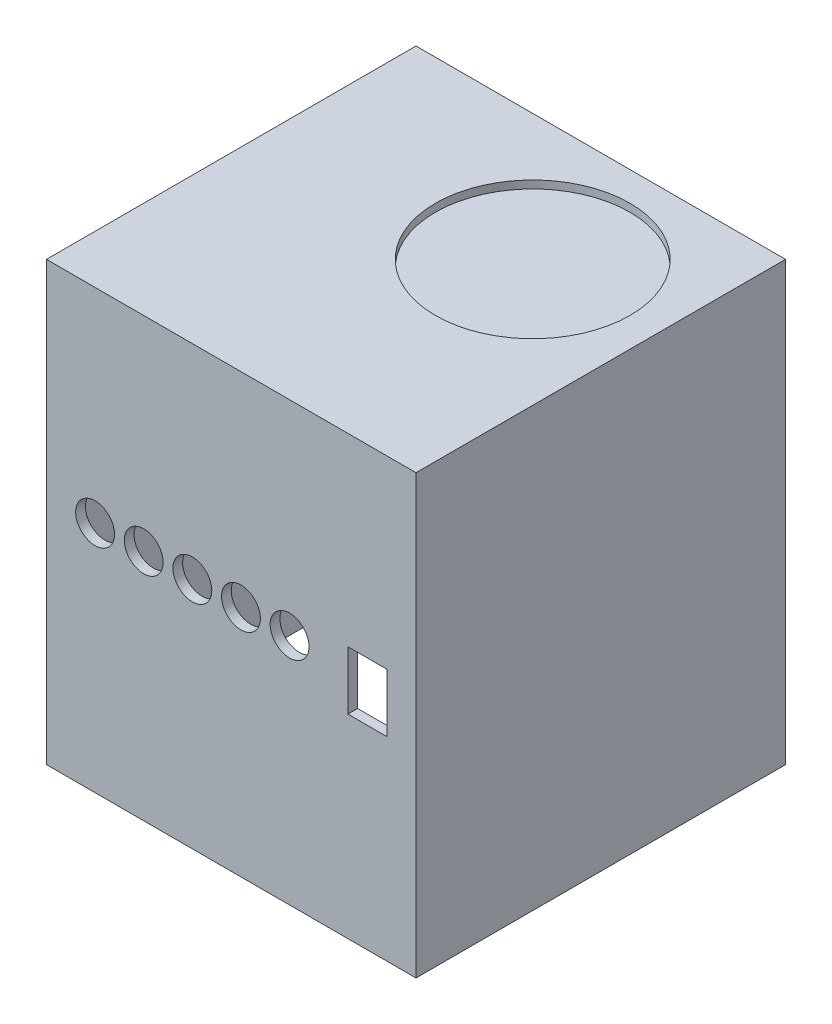
ISO-10303-21;
HEADER;
FILE_DESCRIPTION(('STEP AP214'),'2;1');
FILE_NAME('part.step','',(''),(''),'','','');
FILE_SCHEMA(('AUTOMOTIVE_DESIGN { 1 0 10303 214 1 1 1 1 }'));
ENDSEC;
DATA;
#1=APPLICATION_CONTEXT('core data for automotive mechanical design processes');
#2=APPLICATION_PROTOCOL_DEFINITION('international standard','automotive_design',2000,#1);
#3=PRODUCT_CONTEXT('',#1,'mechanical');
#4=PRODUCT('Part','Part','',(#3));
#5=PRODUCT_RELATED_PRODUCT_CATEGORY('part','',(#4));
#6=PRODUCT_DEFINITION_FORMATION('','',#4);
#7=PRODUCT_DEFINITION_CONTEXT('part definition',#1,'design');
#8=PRODUCT_DEFINITION('design','',#6,#7);
#9=PRODUCT_DEFINITION_SHAPE('','',#8);
#10=(LENGTH_UNIT() NAMED_UNIT(*) SI_UNIT(.MILLI.,.METRE.));
#11=(NAMED_UNIT(*) PLANE_ANGLE_UNIT() SI_UNIT($,.RADIAN.));
#12=(NAMED_UNIT(*) SI_UNIT($,.STERADIAN.) SOLID_ANGLE_UNIT());
#13=UNCERTAINTY_MEASURE_WITH_UNIT(LENGTH_MEASURE(1.E-05),#10,'distance_accuracy_value','');
#14=(GEOMETRIC_REPRESENTATION_CONTEXT(3) GLOBAL_UNCERTAINTY_ASSIGNED_CONTEXT((#13)) GLOBAL_UNIT_ASSIGNED_CONTEXT((#10,
#11,#12)) REPRESENTATION_CONTEXT('',''));
#15=CARTESIAN_POINT('',(0.,0.,0.));
#16=DIRECTION('',(0.,0.,1.));
#17=DIRECTION('',(1.,0.,0.));
#18=AXIS2_PLACEMENT_3D('',#15,#16,#17);
#19=CARTESIAN_POINT('',(0.,0.,0.));
#20=DIRECTION('',(0.,-1.,0.));
#21=DIRECTION('',(0.,0.,-1.));
#22=AXIS2_PLACEMENT_3D('',#19,#20,#21);
#23=PLANE('',#22);
#24=DIRECTION('',(0.,0.,1.));
#25=VECTOR('',#24,1.);
#26=CARTESIAN_POINT('',(-47.5,0.,0.));
#27=LINE('',#26,#25);
#28=CARTESIAN_POINT('',(-47.5,0.,-47.5));
#29=VERTEX_POINT('',#28);
#30=CARTESIAN_POINT('',(-47.5,0.,47.5));
#31=VERTEX_POINT('',#30);
#32=EDGE_CURVE('E187',#29,#31,#27,.T.);
#33=ORIENTED_EDGE('',*,*,#32,.F.);
#34=DIRECTION('',(-1.,0.,0.));
#35=VECTOR('',#34,1.);
#36=CARTESIAN_POINT('',(0.,0.,-47.5));
#37=LINE('',#36,#35);
#38=CARTESIAN_POINT('',(47.5,0.,-47.5));
#39=VERTEX_POINT('',#38);
#40=EDGE_CURVE('E199',#39,#29,#37,.T.);
#41=ORIENTED_EDGE('',*,*,#40,.F.);
#42=DIRECTION('',(0.,0.,-1.));
#43=VECTOR('',#42,1.);
#44=CARTESIAN_POINT('',(47.5,0.,0.));
#45=LINE('',#44,#43);
#46=CARTESIAN_POINT('',(47.5,0.,47.5));
#47=VERTEX_POINT('',#46);
#48=EDGE_CURVE('E217',#47,#39,#45,.T.);
#49=ORIENTED_EDGE('',*,*,#48,.F.);
#50=DIRECTION('',(1.,0.,0.));
#51=VECTOR('',#50,1.);
#52=CARTESIAN_POINT('',(0.,0.,47.5));
#53=LINE('',#52,#51);
#54=EDGE_CURVE('E216',#31,#47,#53,.T.);
#55=ORIENTED_EDGE('',*,*,#54,.F.);
#56=EDGE_LOOP('',(#33,#41,#49,#55));
#57=FACE_BOUND('',#56,.T.);
#58=DIRECTION('',(-1.,0.,0.));
#59=VECTOR('',#58,1.);
#60=CARTESIAN_POINT('',(-45.,0.,-45.));
#61=LINE('',#60,#59);
#62=CARTESIAN_POINT('',(45.,0.,-45.));
#63=VERTEX_POINT('',#62);
#64=CARTESIAN_POINT('',(-45.,0.,-45.));
#65=VERTEX_POINT('',#64);
#66=EDGE_CURVE('E162',#63,#65,#61,.T.);
#67=ORIENTED_EDGE('',*,*,#66,.T.);
#68=DIRECTION('',(0.,0.,1.));
#69=VECTOR('',#68,1.);
#70=CARTESIAN_POINT('',(-45.,0.,45.));
#71=LINE('',#70,#69);
#72=CARTESIAN_POINT('',(-45.,0.,45.));
#73=VERTEX_POINT('',#72);
#74=EDGE_CURVE('E168',#65,#73,#71,.T.);
#75=ORIENTED_EDGE('',*,*,#74,.T.);
#76=DIRECTION('',(1.,0.,0.));
#77=VECTOR('',#76,1.);
#78=CARTESIAN_POINT('',(-45.,0.,45.));
#79=LINE('',#78,#77);
#80=CARTESIAN_POINT('',(45.,0.,45.));
#81=VERTEX_POINT('',#80);
#82=EDGE_CURVE('E175',#73,#81,#79,.T.);
#83=ORIENTED_EDGE('',*,*,#82,.T.);
#84=DIRECTION('',(0.,0.,-1.));
#85=VECTOR('',#84,1.);
#86=CARTESIAN_POINT('',(45.,0.,45.));
#87=LINE('',#86,#85);
#88=EDGE_CURVE('E178',#81,#63,#87,.T.);
#89=ORIENTED_EDGE('',*,*,#88,.T.);
#90=EDGE_LOOP('',(#67,#75,#83,#89));
#91=FACE_BOUND('',#90,.T.);
#92=ADVANCED_FACE('F39',(#57,#91),#23,.T.);
#93=CARTESIAN_POINT('',(-47.5,110.,45.));
#94=DIRECTION('',(1.,0.,0.));
#95=DIRECTION('',(0.,0.,-1.));
#96=AXIS2_PLACEMENT_3D('',#93,#94,#95);
#97=PLANE('',#96);
#98=ORIENTED_EDGE('',*,*,#32,.T.);
#99=DIRECTION('',(0.,-1.,0.));
#100=VECTOR('',#99,1.);
#101=CARTESIAN_POINT('',(-47.5,110.,47.5));
#102=LINE('',#101,#100);
#103=CARTESIAN_POINT('',(-47.5,112.5,47.5));
#104=VERTEX_POINT('',#103);
#105=EDGE_CURVE('E193',#104,#31,#102,.T.);
#106=ORIENTED_EDGE('',*,*,#105,.F.);
#107=DIRECTION('',(0.,0.,1.));
#108=VECTOR('',#107,1.);
#109=CARTESIAN_POINT('',(-47.5,112.5,0.));
#110=LINE('',#109,#108);
#111=CARTESIAN_POINT('',(-47.5,112.5,-47.5));
#112=VERTEX_POINT('',#111);
#113=EDGE_CURVE('E198',#112,#104,#110,.T.);
#114=ORIENTED_EDGE('',*,*,#113,.F.);
#115=DIRECTION('',(0.,-1.,0.));
#116=VECTOR('',#115,1.);
#117=CARTESIAN_POINT('',(-47.5,110.,-47.5));
#118=LINE('',#117,#116);
#119=EDGE_CURVE('E203',#112,#29,#118,.T.);
#120=ORIENTED_EDGE('',*,*,#119,.T.);
#121=EDGE_LOOP('',(#98,#106,#114,#120));
#122=FACE_BOUND('',#121,.T.);
#123=ADVANCED_FACE('F285',(#122),#97,.F.);
#124=CARTESIAN_POINT('',(-45.,110.,47.5));
#125=DIRECTION('',(0.,0.,-1.));
#126=DIRECTION('',(-1.,0.,0.));
#127=AXIS2_PLACEMENT_3D('',#124,#125,#126);
#128=PLANE('',#127);
#129=CARTESIAN_POINT('',(-35.,60.,47.5));
#130=DIRECTION('',(0.,0.,1.));
#131=DIRECTION('',(1.,0.,0.));
#132=AXIS2_PLACEMENT_3D('',#129,#130,#131);
#133=CIRCLE('',#132,5.);
#134=CARTESIAN_POINT('',(-30.,60.,47.5));
#135=VERTEX_POINT('',#134);
#136=EDGE_CURVE('E228',#135,#135,#133,.T.);
#137=ORIENTED_EDGE('',*,*,#136,.F.);
#138=EDGE_LOOP('',(#137));
#139=FACE_BOUND('',#138,.T.);
#140=CARTESIAN_POINT('',(-22.5,60.,47.5));
#141=DIRECTION('',(0.,0.,1.));
#142=DIRECTION('',(1.,0.,0.));
#143=AXIS2_PLACEMENT_3D('',#140,#141,#142);
#144=CIRCLE('',#143,5.);
#145=CARTESIAN_POINT('',(-17.5,60.,47.5));
#146=VERTEX_POINT('',#145);
#147=EDGE_CURVE('E332',#146,#146,#144,.T.);
#148=ORIENTED_EDGE('',*,*,#147,.F.);
#149=EDGE_LOOP('',(#148));
#150=FACE_BOUND('',#149,.T.);
#151=CARTESIAN_POINT('',(-10.,60.,47.5));
#152=DIRECTION('',(0.,0.,1.));
#153=DIRECTION('',(1.,0.,0.));
#154=AXIS2_PLACEMENT_3D('',#151,#152,#153);
#155=CIRCLE('',#154,5.);
#156=CARTESIAN_POINT('',(-5.,60.,47.5));
#157=VERTEX_POINT('',#156);
#158=EDGE_CURVE('E331',#157,#157,#155,.T.);
#159=ORIENTED_EDGE('',*,*,#158,.F.);
#160=EDGE_LOOP('',(#159));
#161=FACE_BOUND('',#160,.T.);
#162=CARTESIAN_POINT('',(2.5,60.,47.5));
#163=DIRECTION('',(0.,0.,1.));
#164=DIRECTION('',(1.,0.,0.));
#165=AXIS2_PLACEMENT_3D('',#162,#163,#164);
#166=CIRCLE('',#165,5.);
#167=CARTESIAN_POINT('',(7.5,60.,47.5));
#168=VERTEX_POINT('',#167);
#169=EDGE_CURVE('E152',#168,#168,#166,.T.);
#170=ORIENTED_EDGE('',*,*,#169,.F.);
#171=EDGE_LOOP('',(#170));
#172=FACE_BOUND('',#171,.T.);
#173=CARTESIAN_POINT('',(15.,60.,47.5));
#174=DIRECTION('',(0.,0.,1.));
#175=DIRECTION('',(1.,0.,0.));
#176=AXIS2_PLACEMENT_3D('',#173,#174,#175);
#177=CIRCLE('',#176,5.);
#178=CARTESIAN_POINT('',(20.,60.,47.5));
#179=VERTEX_POINT('',#178);
#180=EDGE_CURVE('E151',#179,#179,#177,.T.);
#181=ORIENTED_EDGE('',*,*,#180,.F.);
#182=EDGE_LOOP('',(#181));
#183=FACE_BOUND('',#182,.T.);
#184=DIRECTION('',(1.,0.,0.));
#185=VECTOR('',#184,1.);
#186=CARTESIAN_POINT('',(30.,50.,47.5));
#187=LINE('',#186,#185);
#188=CARTESIAN_POINT('',(30.,50.,47.5));
#189=VERTEX_POINT('',#188);
#190=CARTESIAN_POINT('',(40.,50.,47.5));
#191=VERTEX_POINT('',#190);
#192=EDGE_CURVE('E147',#189,#191,#187,.T.);
#193=ORIENTED_EDGE('',*,*,#192,.F.);
#194=DIRECTION('',(0.,-1.,0.));
#195=VECTOR('',#194,1.);
#196=CARTESIAN_POINT('',(30.,65.,47.5));
#197=LINE('',#196,#195);
#198=CARTESIAN_POINT('',(30.,65.,47.5));
#199=VERTEX_POINT('',#198);
#200=EDGE_CURVE('E57',#199,#189,#197,.T.);
#201=ORIENTED_EDGE('',*,*,#200,.F.);
#202=DIRECTION('',(-1.,0.,0.));
#203=VECTOR('',#202,1.);
#204=CARTESIAN_POINT('',(30.,65.,47.5));
#205=LINE('',#204,#203);
#206=CARTESIAN_POINT('',(40.,65.,47.5));
#207=VERTEX_POINT('',#206);
#208=EDGE_CURVE('E136',#207,#199,#205,.T.);
#209=ORIENTED_EDGE('',*,*,#208,.F.);
#210=DIRECTION('',(0.,1.,0.));
#211=VECTOR('',#210,1.);
#212=CARTESIAN_POINT('',(40.,65.,47.5));
#213=LINE('',#212,#211);
#214=EDGE_CURVE('E145',#191,#207,#213,.T.);
#215=ORIENTED_EDGE('',*,*,#214,.F.);
#216=EDGE_LOOP('',(#193,#201,#209,#215));
#217=FACE_BOUND('',#216,.T.);
#218=ORIENTED_EDGE('',*,*,#54,.T.);
#219=DIRECTION('',(0.,-1.,0.));
#220=VECTOR('',#219,1.);
#221=CARTESIAN_POINT('',(47.5,110.,47.5));
#222=LINE('',#221,#220);
#223=CARTESIAN_POINT('',(47.5,112.5,47.5));
#224=VERTEX_POINT('',#223);
#225=EDGE_CURVE('E192',#224,#47,#222,.T.);
#226=ORIENTED_EDGE('',*,*,#225,.F.);
#227=DIRECTION('',(1.,0.,0.));
#228=VECTOR('',#227,1.);
#229=CARTESIAN_POINT('',(0.,112.5,47.5));
#230=LINE('',#229,#228);
#231=EDGE_CURVE('E200',#104,#224,#230,.T.);
#232=ORIENTED_EDGE('',*,*,#231,.F.);
#233=ORIENTED_EDGE('',*,*,#105,.T.);
#234=EDGE_LOOP('',(#218,#226,#232,#233));
#235=FACE_BOUND('',#234,.T.);
#236=ADVANCED_FACE('F146',(#139,#150,#161,#172,#183,#217,#235),#128,.F.);
#237=CARTESIAN_POINT('',(47.5,110.,45.));
#238=DIRECTION('',(-1.,0.,0.));
#239=DIRECTION('',(0.,0.,1.));
#240=AXIS2_PLACEMENT_3D('',#237,#238,#239);
#241=PLANE('',#240);
#242=ORIENTED_EDGE('',*,*,#48,.T.);
#243=DIRECTION('',(0.,-1.,0.));
#244=VECTOR('',#243,1.);
#245=CARTESIAN_POINT('',(47.5,110.,-47.5));
#246=LINE('',#245,#244);
#247=CARTESIAN_POINT('',(47.5,112.5,-47.5));
#248=VERTEX_POINT('',#247);
#249=EDGE_CURVE('E204',#248,#39,#246,.T.);
#250=ORIENTED_EDGE('',*,*,#249,.F.);
#251=DIRECTION('',(0.,0.,-1.));
#252=VECTOR('',#251,1.);
#253=CARTESIAN_POINT('',(47.5,112.5,0.));
#254=LINE('',#253,#252);
#255=EDGE_CURVE('E207',#224,#248,#254,.T.);
#256=ORIENTED_EDGE('',*,*,#255,.F.);
#257=ORIENTED_EDGE('',*,*,#225,.T.);
#258=EDGE_LOOP('',(#242,#250,#256,#257));
#259=FACE_BOUND('',#258,.T.);
#260=ADVANCED_FACE('F299',(#259),#241,.F.);
#261=CARTESIAN_POINT('',(-45.,110.,-47.5));
#262=DIRECTION('',(0.,0.,1.));
#263=DIRECTION('',(1.,0.,0.));
#264=AXIS2_PLACEMENT_3D('',#261,#262,#263);
#265=PLANE('',#264);
#266=ORIENTED_EDGE('',*,*,#40,.T.);
#267=ORIENTED_EDGE('',*,*,#119,.F.);
#268=DIRECTION('',(-1.,0.,0.));
#269=VECTOR('',#268,1.);
#270=CARTESIAN_POINT('',(0.,112.5,-47.5));
#271=LINE('',#270,#269);
#272=EDGE_CURVE('E202',#248,#112,#271,.T.);
#273=ORIENTED_EDGE('',*,*,#272,.F.);
#274=ORIENTED_EDGE('',*,*,#249,.T.);
#275=EDGE_LOOP('',(#266,#267,#273,#274));
#276=FACE_BOUND('',#275,.T.);
#277=ADVANCED_FACE('F298',(#276),#265,.F.);
#278=CARTESIAN_POINT('',(0.,112.5,0.));
#279=DIRECTION('',(0.,-1.,0.));
#280=DIRECTION('',(0.,0.,-1.));
#281=AXIS2_PLACEMENT_3D('',#278,#279,#280);
#282=PLANE('',#281);
#283=CARTESIAN_POINT('',(15.,112.5,-15.));
#284=DIRECTION('',(0.,1.,0.));
#285=DIRECTION('',(0.,0.,1.));
#286=AXIS2_PLACEMENT_3D('',#283,#284,#285);
#287=CIRCLE('',#286,25.);
#288=CARTESIAN_POINT('',(15.,112.5,10.));
#289=VERTEX_POINT('',#288);
#290=EDGE_CURVE('E323',#289,#289,#287,.T.);
#291=ORIENTED_EDGE('',*,*,#290,.F.);
#292=EDGE_LOOP('',(#291));
#293=FACE_BOUND('',#292,.T.);
#294=ORIENTED_EDGE('',*,*,#113,.T.);
#295=ORIENTED_EDGE('',*,*,#231,.T.);
#296=ORIENTED_EDGE('',*,*,#255,.T.);
#297=ORIENTED_EDGE('',*,*,#272,.T.);
#298=EDGE_LOOP('',(#294,#295,#296,#297));
#299=FACE_BOUND('',#298,.T.);
#300=ADVANCED_FACE('F41',(#293,#299),#282,.F.);
#301=CARTESIAN_POINT('',(-45.,110.,45.));
#302=DIRECTION('',(1.,0.,0.));
#303=DIRECTION('',(0.,0.,-1.));
#304=AXIS2_PLACEMENT_3D('',#301,#302,#303);
#305=PLANE('',#304);
#306=ORIENTED_EDGE('',*,*,#74,.F.);
#307=DIRECTION('',(0.,-1.,0.));
#308=VECTOR('',#307,1.);
#309=CARTESIAN_POINT('',(-45.,110.,-45.));
#310=LINE('',#309,#308);
#311=CARTESIAN_POINT('',(-45.,110.,-45.));
#312=VERTEX_POINT('',#311);
#313=EDGE_CURVE('E166',#312,#65,#310,.T.);
#314=ORIENTED_EDGE('',*,*,#313,.F.);
#315=DIRECTION('',(0.,0.,1.));
#316=VECTOR('',#315,1.);
#317=CARTESIAN_POINT('',(-45.,110.,45.));
#318=LINE('',#317,#316);
#319=CARTESIAN_POINT('',(-45.,110.,45.));
#320=VERTEX_POINT('',#319);
#321=EDGE_CURVE('E157',#312,#320,#318,.T.);
#322=ORIENTED_EDGE('',*,*,#321,.T.);
#323=DIRECTION('',(0.,-1.,0.));
#324=VECTOR('',#323,1.);
#325=CARTESIAN_POINT('',(-45.,110.,45.));
#326=LINE('',#325,#324);
#327=EDGE_CURVE('E186',#320,#73,#326,.T.);
#328=ORIENTED_EDGE('',*,*,#327,.T.);
#329=EDGE_LOOP('',(#306,#314,#322,#328));
#330=FACE_BOUND('',#329,.T.);
#331=ADVANCED_FACE('F246',(#330),#305,.T.);
#332=CARTESIAN_POINT('',(-45.,110.,45.));
#333=DIRECTION('',(0.,0.,-1.));
#334=DIRECTION('',(-1.,0.,0.));
#335=AXIS2_PLACEMENT_3D('',#332,#333,#334);
#336=PLANE('',#335);
#337=CARTESIAN_POINT('',(-35.,60.,45.));
#338=DIRECTION('',(0.,0.,-1.));
#339=DIRECTION('',(-1.,0.,0.));
#340=AXIS2_PLACEMENT_3D('',#337,#338,#339);
#341=CIRCLE('',#340,5.);
#342=CARTESIAN_POINT('',(-40.,60.,45.));
#343=VERTEX_POINT('',#342);
#344=EDGE_CURVE('E43',#343,#343,#341,.T.);
#345=ORIENTED_EDGE('',*,*,#344,.F.);
#346=EDGE_LOOP('',(#345));
#347=FACE_BOUND('',#346,.T.);
#348=CARTESIAN_POINT('',(-22.5,60.,45.));
#349=DIRECTION('',(0.,0.,-1.));
#350=DIRECTION('',(-1.,0.,0.));
#351=AXIS2_PLACEMENT_3D('',#348,#349,#350);
#352=CIRCLE('',#351,5.);
#353=CARTESIAN_POINT('',(-27.5,60.,45.));
#354=VERTEX_POINT('',#353);
#355=EDGE_CURVE('E234',#354,#354,#352,.T.);
#356=ORIENTED_EDGE('',*,*,#355,.F.);
#357=EDGE_LOOP('',(#356));
#358=FACE_BOUND('',#357,.T.);
#359=CARTESIAN_POINT('',(-10.,60.,45.));
#360=DIRECTION('',(0.,0.,-1.));
#361=DIRECTION('',(-1.,0.,0.));
#362=AXIS2_PLACEMENT_3D('',#359,#360,#361);
#363=CIRCLE('',#362,5.);
#364=CARTESIAN_POINT('',(-15.,60.,45.));
#365=VERTEX_POINT('',#364);
#366=EDGE_CURVE('E235',#365,#365,#363,.T.);
#367=ORIENTED_EDGE('',*,*,#366,.F.);
#368=EDGE_LOOP('',(#367));
#369=FACE_BOUND('',#368,.T.);
#370=CARTESIAN_POINT('',(2.5,60.,45.));
#371=DIRECTION('',(0.,0.,-1.));
#372=DIRECTION('',(-1.,0.,0.));
#373=AXIS2_PLACEMENT_3D('',#370,#371,#372);
#374=CIRCLE('',#373,5.);
#375=CARTESIAN_POINT('',(-2.5,60.,45.));
#376=VERTEX_POINT('',#375);
#377=EDGE_CURVE('E230',#376,#376,#374,.T.);
#378=ORIENTED_EDGE('',*,*,#377,.F.);
#379=EDGE_LOOP('',(#378));
#380=FACE_BOUND('',#379,.T.);
#381=CARTESIAN_POINT('',(15.,60.,45.));
#382=DIRECTION('',(0.,0.,-1.));
#383=DIRECTION('',(-1.,0.,0.));
#384=AXIS2_PLACEMENT_3D('',#381,#382,#383);
#385=CIRCLE('',#384,5.);
#386=CARTESIAN_POINT('',(10.,60.,45.));
#387=VERTEX_POINT('',#386);
#388=EDGE_CURVE('E223',#387,#387,#385,.T.);
#389=ORIENTED_EDGE('',*,*,#388,.F.);
#390=EDGE_LOOP('',(#389));
#391=FACE_BOUND('',#390,.T.);
#392=DIRECTION('',(0.,1.,0.));
#393=VECTOR('',#392,1.);
#394=CARTESIAN_POINT('',(30.,110.,45.));
#395=LINE('',#394,#393);
#396=CARTESIAN_POINT('',(30.,50.,45.));
#397=VERTEX_POINT('',#396);
#398=CARTESIAN_POINT('',(30.,65.,45.));
#399=VERTEX_POINT('',#398);
#400=EDGE_CURVE('E11',#397,#399,#395,.T.);
#401=ORIENTED_EDGE('',*,*,#400,.F.);
#402=DIRECTION('',(-1.,0.,0.));
#403=VECTOR('',#402,1.);
#404=CARTESIAN_POINT('',(-45.,50.,45.));
#405=LINE('',#404,#403);
#406=CARTESIAN_POINT('',(40.,50.,45.));
#407=VERTEX_POINT('',#406);
#408=EDGE_CURVE('E194',#407,#397,#405,.T.);
#409=ORIENTED_EDGE('',*,*,#408,.F.);
#410=DIRECTION('',(0.,-1.,0.));
#411=VECTOR('',#410,1.);
#412=CARTESIAN_POINT('',(40.,110.,45.));
#413=LINE('',#412,#411);
#414=CARTESIAN_POINT('',(40.,65.,45.));
#415=VERTEX_POINT('',#414);
#416=EDGE_CURVE('E225',#415,#407,#413,.T.);
#417=ORIENTED_EDGE('',*,*,#416,.F.);
#418=DIRECTION('',(1.,0.,0.));
#419=VECTOR('',#418,1.);
#420=CARTESIAN_POINT('',(-45.,65.,45.));
#421=LINE('',#420,#419);
#422=EDGE_CURVE('E48',#399,#415,#421,.T.);
#423=ORIENTED_EDGE('',*,*,#422,.F.);
#424=EDGE_LOOP('',(#401,#409,#417,#423));
#425=FACE_BOUND('',#424,.T.);
#426=ORIENTED_EDGE('',*,*,#82,.F.);
#427=ORIENTED_EDGE('',*,*,#327,.F.);
#428=DIRECTION('',(1.,0.,0.));
#429=VECTOR('',#428,1.);
#430=CARTESIAN_POINT('',(-45.,110.,45.));
#431=LINE('',#430,#429);
#432=CARTESIAN_POINT('',(45.,110.,45.));
#433=VERTEX_POINT('',#432);
#434=EDGE_CURVE('E165',#320,#433,#431,.T.);
#435=ORIENTED_EDGE('',*,*,#434,.T.);
#436=DIRECTION('',(0.,-1.,0.));
#437=VECTOR('',#436,1.);
#438=CARTESIAN_POINT('',(45.,110.,45.));
#439=LINE('',#438,#437);
#440=EDGE_CURVE('E184',#433,#81,#439,.T.);
#441=ORIENTED_EDGE('',*,*,#440,.T.);
#442=EDGE_LOOP('',(#426,#427,#435,#441));
#443=FACE_BOUND('',#442,.T.);
#444=ADVANCED_FACE('F243',(#347,#358,#369,#380,#391,#425,#443),#336,.T.);
#445=CARTESIAN_POINT('',(45.,110.,45.));
#446=DIRECTION('',(-1.,0.,0.));
#447=DIRECTION('',(0.,0.,1.));
#448=AXIS2_PLACEMENT_3D('',#445,#446,#447);
#449=PLANE('',#448);
#450=ORIENTED_EDGE('',*,*,#88,.F.);
#451=ORIENTED_EDGE('',*,*,#440,.F.);
#452=DIRECTION('',(0.,0.,-1.));
#453=VECTOR('',#452,1.);
#454=CARTESIAN_POINT('',(45.,110.,45.));
#455=LINE('',#454,#453);
#456=CARTESIAN_POINT('',(45.,110.,-45.));
#457=VERTEX_POINT('',#456);
#458=EDGE_CURVE('E164',#433,#457,#455,.T.);
#459=ORIENTED_EDGE('',*,*,#458,.T.);
#460=DIRECTION('',(0.,-1.,0.));
#461=VECTOR('',#460,1.);
#462=CARTESIAN_POINT('',(45.,110.,-45.));
#463=LINE('',#462,#461);
#464=EDGE_CURVE('E185',#457,#63,#463,.T.);
#465=ORIENTED_EDGE('',*,*,#464,.T.);
#466=EDGE_LOOP('',(#450,#451,#459,#465));
#467=FACE_BOUND('',#466,.T.);
#468=ADVANCED_FACE('F250',(#467),#449,.T.);
#469=CARTESIAN_POINT('',(-45.,110.,-45.));
#470=DIRECTION('',(0.,0.,1.));
#471=DIRECTION('',(1.,0.,0.));
#472=AXIS2_PLACEMENT_3D('',#469,#470,#471);
#473=PLANE('',#472);
#474=ORIENTED_EDGE('',*,*,#66,.F.);
#475=ORIENTED_EDGE('',*,*,#464,.F.);
#476=DIRECTION('',(-1.,0.,0.));
#477=VECTOR('',#476,1.);
#478=CARTESIAN_POINT('',(-45.,110.,-45.));
#479=LINE('',#478,#477);
#480=EDGE_CURVE('E170',#457,#312,#479,.T.);
#481=ORIENTED_EDGE('',*,*,#480,.T.);
#482=ORIENTED_EDGE('',*,*,#313,.T.);
#483=EDGE_LOOP('',(#474,#475,#481,#482));
#484=FACE_BOUND('',#483,.T.);
#485=ADVANCED_FACE('F267',(#484),#473,.T.);
#486=CARTESIAN_POINT('',(0.,110.,0.));
#487=DIRECTION('',(0.,-1.,0.));
#488=DIRECTION('',(0.,0.,-1.));
#489=AXIS2_PLACEMENT_3D('',#486,#487,#488);
#490=PLANE('',#489);
#491=ORIENTED_EDGE('',*,*,#321,.F.);
#492=ORIENTED_EDGE('',*,*,#480,.F.);
#493=ORIENTED_EDGE('',*,*,#458,.F.);
#494=ORIENTED_EDGE('',*,*,#434,.F.);
#495=EDGE_LOOP('',(#491,#492,#493,#494));
#496=FACE_BOUND('',#495,.T.);
#497=ADVANCED_FACE('F275',(#496),#490,.T.);
#498=CARTESIAN_POINT('',(30.,65.,37.5));
#499=DIRECTION('',(-1.,0.,0.));
#500=DIRECTION('',(0.,0.,1.));
#501=AXIS2_PLACEMENT_3D('',#498,#499,#500);
#502=PLANE('',#501);
#503=ORIENTED_EDGE('',*,*,#400,.T.);
#504=DIRECTION('',(0.,0.,1.));
#505=VECTOR('',#504,1.);
#506=CARTESIAN_POINT('',(30.,65.,37.5));
#507=LINE('',#506,#505);
#508=EDGE_CURVE('E126',#399,#199,#507,.T.);
#509=ORIENTED_EDGE('',*,*,#508,.T.);
#510=ORIENTED_EDGE('',*,*,#200,.T.);
#511=DIRECTION('',(0.,0.,1.));
#512=VECTOR('',#511,1.);
#513=CARTESIAN_POINT('',(30.,50.,37.5));
#514=LINE('',#513,#512);
#515=EDGE_CURVE('E144',#397,#189,#514,.T.);
#516=ORIENTED_EDGE('',*,*,#515,.F.);
#517=EDGE_LOOP('',(#503,#509,#510,#516));
#518=FACE_BOUND('',#517,.T.);
#519=ADVANCED_FACE('F128',(#518),#502,.F.);
#520=CARTESIAN_POINT('',(30.,65.,37.5));
#521=DIRECTION('',(0.,1.,0.));
#522=DIRECTION('',(0.,0.,1.));
#523=AXIS2_PLACEMENT_3D('',#520,#521,#522);
#524=PLANE('',#523);
#525=ORIENTED_EDGE('',*,*,#422,.T.);
#526=DIRECTION('',(0.,0.,1.));
#527=VECTOR('',#526,1.);
#528=CARTESIAN_POINT('',(40.,65.,37.5));
#529=LINE('',#528,#527);
#530=EDGE_CURVE('E133',#415,#207,#529,.T.);
#531=ORIENTED_EDGE('',*,*,#530,.T.);
#532=ORIENTED_EDGE('',*,*,#208,.T.);
#533=ORIENTED_EDGE('',*,*,#508,.F.);
#534=EDGE_LOOP('',(#525,#531,#532,#533));
#535=FACE_BOUND('',#534,.T.);
#536=ADVANCED_FACE('F139',(#535),#524,.F.);
#537=CARTESIAN_POINT('',(40.,65.,37.5));
#538=DIRECTION('',(1.,0.,0.));
#539=DIRECTION('',(0.,0.,-1.));
#540=AXIS2_PLACEMENT_3D('',#537,#538,#539);
#541=PLANE('',#540);
#542=ORIENTED_EDGE('',*,*,#416,.T.);
#543=DIRECTION('',(0.,0.,1.));
#544=VECTOR('',#543,1.);
#545=CARTESIAN_POINT('',(40.,50.,37.5));
#546=LINE('',#545,#544);
#547=EDGE_CURVE('E63',#407,#191,#546,.T.);
#548=ORIENTED_EDGE('',*,*,#547,.T.);
#549=ORIENTED_EDGE('',*,*,#214,.T.);
#550=ORIENTED_EDGE('',*,*,#530,.F.);
#551=EDGE_LOOP('',(#542,#548,#549,#550));
#552=FACE_BOUND('',#551,.T.);
#553=ADVANCED_FACE('F345',(#552),#541,.F.);
#554=CARTESIAN_POINT('',(30.,50.,37.5));
#555=DIRECTION('',(0.,-1.,0.));
#556=DIRECTION('',(0.,0.,-1.));
#557=AXIS2_PLACEMENT_3D('',#554,#555,#556);
#558=PLANE('',#557);
#559=ORIENTED_EDGE('',*,*,#408,.T.);
#560=ORIENTED_EDGE('',*,*,#515,.T.);
#561=ORIENTED_EDGE('',*,*,#192,.T.);
#562=ORIENTED_EDGE('',*,*,#547,.F.);
#563=EDGE_LOOP('',(#559,#560,#561,#562));
#564=FACE_BOUND('',#563,.T.);
#565=ADVANCED_FACE('F344',(#564),#558,.F.);
#566=CARTESIAN_POINT('',(15.,60.,37.5));
#567=DIRECTION('',(0.,0.,1.));
#568=DIRECTION('',(1.,0.,0.));
#569=AXIS2_PLACEMENT_3D('',#566,#567,#568);
#570=CYLINDRICAL_SURFACE('',#569,5.);
#571=ORIENTED_EDGE('',*,*,#388,.T.);
#572=EDGE_LOOP('',(#571));
#573=FACE_BOUND('',#572,.T.);
#574=ORIENTED_EDGE('',*,*,#180,.T.);
#575=EDGE_LOOP('',(#574));
#576=FACE_BOUND('',#575,.T.);
#577=ADVANCED_FACE('F347',(#573,#576),#570,.F.);
#578=CARTESIAN_POINT('',(2.5,60.,37.5));
#579=DIRECTION('',(0.,0.,1.));
#580=DIRECTION('',(1.,0.,0.));
#581=AXIS2_PLACEMENT_3D('',#578,#579,#580);
#582=CYLINDRICAL_SURFACE('',#581,5.);
#583=ORIENTED_EDGE('',*,*,#377,.T.);
#584=EDGE_LOOP('',(#583));
#585=FACE_BOUND('',#584,.T.);
#586=ORIENTED_EDGE('',*,*,#169,.T.);
#587=EDGE_LOOP('',(#586));
#588=FACE_BOUND('',#587,.T.);
#589=ADVANCED_FACE('F351',(#585,#588),#582,.F.);
#590=CARTESIAN_POINT('',(-10.,60.,37.5));
#591=DIRECTION('',(0.,0.,1.));
#592=DIRECTION('',(1.,0.,0.));
#593=AXIS2_PLACEMENT_3D('',#590,#591,#592);
#594=CYLINDRICAL_SURFACE('',#593,5.);
#595=ORIENTED_EDGE('',*,*,#366,.T.);
#596=EDGE_LOOP('',(#595));
#597=FACE_BOUND('',#596,.T.);
#598=ORIENTED_EDGE('',*,*,#158,.T.);
#599=EDGE_LOOP('',(#598));
#600=FACE_BOUND('',#599,.T.);
#601=ADVANCED_FACE('F396',(#597,#600),#594,.F.);
#602=CARTESIAN_POINT('',(-22.5,60.,37.5));
#603=DIRECTION('',(0.,0.,1.));
#604=DIRECTION('',(1.,0.,0.));
#605=AXIS2_PLACEMENT_3D('',#602,#603,#604);
#606=CYLINDRICAL_SURFACE('',#605,5.);
#607=ORIENTED_EDGE('',*,*,#355,.T.);
#608=EDGE_LOOP('',(#607));
#609=FACE_BOUND('',#608,.T.);
#610=ORIENTED_EDGE('',*,*,#147,.T.);
#611=EDGE_LOOP('',(#610));
#612=FACE_BOUND('',#611,.T.);
#613=ADVANCED_FACE('F410',(#609,#612),#606,.F.);
#614=CARTESIAN_POINT('',(-35.,60.,37.5));
#615=DIRECTION('',(0.,0.,1.));
#616=DIRECTION('',(1.,0.,0.));
#617=AXIS2_PLACEMENT_3D('',#614,#615,#616);
#618=CYLINDRICAL_SURFACE('',#617,5.);
#619=ORIENTED_EDGE('',*,*,#344,.T.);
#620=EDGE_LOOP('',(#619));
#621=FACE_BOUND('',#620,.T.);
#622=ORIENTED_EDGE('',*,*,#136,.T.);
#623=EDGE_LOOP('',(#622));
#624=FACE_BOUND('',#623,.T.);
#625=ADVANCED_FACE('F244',(#621,#624),#618,.F.);
#626=CARTESIAN_POINT('',(15.,110.5,-15.));
#627=DIRECTION('',(0.,1.,0.));
#628=DIRECTION('',(0.,0.,1.));
#629=AXIS2_PLACEMENT_3D('',#626,#627,#628);
#630=CYLINDRICAL_SURFACE('',#629,25.);
#631=CARTESIAN_POINT('',(15.,110.5,-15.));
#632=DIRECTION('',(0.,1.,0.));
#633=DIRECTION('',(0.,0.,1.));
#634=AXIS2_PLACEMENT_3D('',#631,#632,#633);
#635=CIRCLE('',#634,25.);
#636=CARTESIAN_POINT('',(15.,110.5,10.));
#637=VERTEX_POINT('',#636);
#638=EDGE_CURVE('E132',#637,#637,#635,.T.);
#639=ORIENTED_EDGE('',*,*,#638,.F.);
#640=EDGE_LOOP('',(#639));
#641=FACE_BOUND('',#640,.T.);
#642=ORIENTED_EDGE('',*,*,#290,.T.);
#643=EDGE_LOOP('',(#642));
#644=FACE_BOUND('',#643,.T.);
#645=ADVANCED_FACE('F422',(#641,#644),#630,.F.);
#646=CARTESIAN_POINT('',(15.,110.5,-15.));
#647=DIRECTION('',(0.,1.,0.));
#648=DIRECTION('',(0.,0.,1.));
#649=AXIS2_PLACEMENT_3D('',#646,#647,#648);
#650=PLANE('',#649);
#651=ORIENTED_EDGE('',*,*,#638,.T.);
#652=EDGE_LOOP('',(#651));
#653=FACE_BOUND('',#652,.T.);
#654=ADVANCED_FACE('F433',(#653),#650,.T.);
#655=CLOSED_SHELL('',(#92,#123,#236,#260,#277,#300,#331,#444,#468,#485,#497,#519,#536,#553,#565,
#577,#589,#601,#613,#625,#645,#654));
#656=MANIFOLD_SOLID_BREP('B2',#655);
#657=ADVANCED_BREP_SHAPE_REPRESENTATION('',(#18,#656),#14);
#658=SHAPE_DEFINITION_REPRESENTATION(#9,#657);
ENDSEC;
END-ISO-10303-21;
